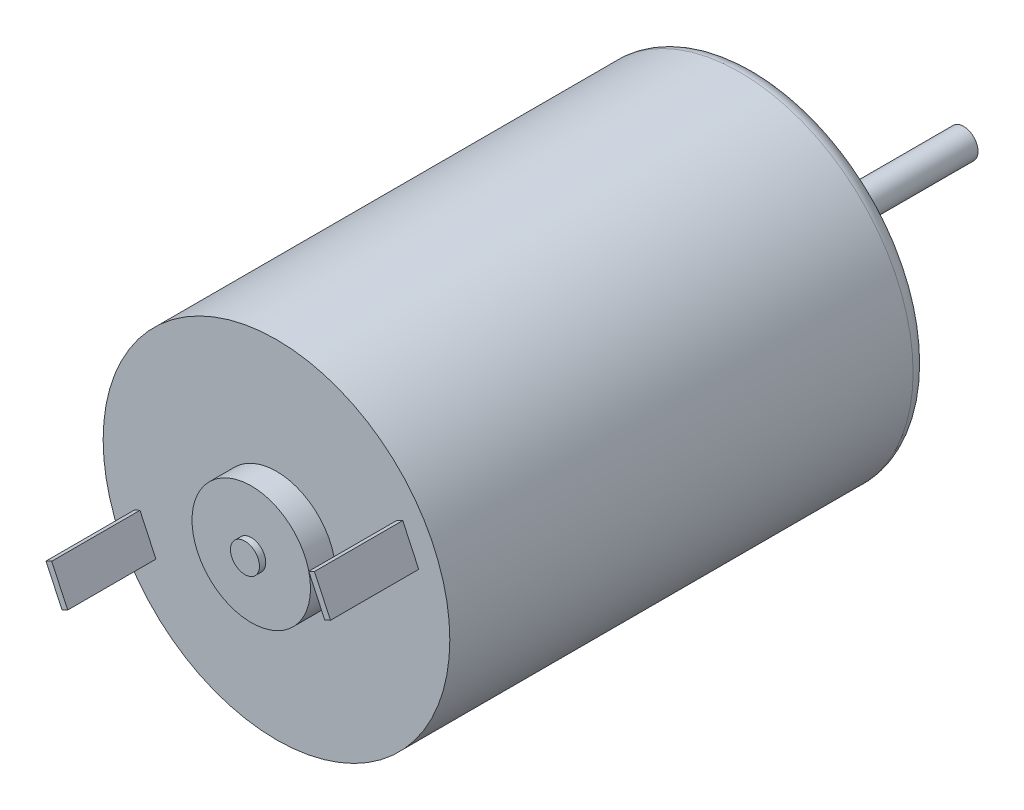
ISO-10303-21;
HEADER;
FILE_DESCRIPTION(('STEP AP214'),'2;1');
FILE_NAME('part.step','',(''),(''),'','','');
FILE_SCHEMA(('AUTOMOTIVE_DESIGN { 1 0 10303 214 1 1 1 1 }'));
ENDSEC;
DATA;
#1=APPLICATION_CONTEXT('core data for automotive mechanical design processes');
#2=APPLICATION_PROTOCOL_DEFINITION('international standard','automotive_design',2000,#1);
#3=PRODUCT_CONTEXT('',#1,'mechanical');
#4=PRODUCT('Part','Part','',(#3));
#5=PRODUCT_RELATED_PRODUCT_CATEGORY('part','',(#4));
#6=PRODUCT_DEFINITION_FORMATION('','',#4);
#7=PRODUCT_DEFINITION_CONTEXT('part definition',#1,'design');
#8=PRODUCT_DEFINITION('design','',#6,#7);
#9=PRODUCT_DEFINITION_SHAPE('','',#8);
#10=(LENGTH_UNIT() NAMED_UNIT(*) SI_UNIT(.MILLI.,.METRE.));
#11=(NAMED_UNIT(*) PLANE_ANGLE_UNIT() SI_UNIT($,.RADIAN.));
#12=(NAMED_UNIT(*) SI_UNIT($,.STERADIAN.) SOLID_ANGLE_UNIT());
#13=UNCERTAINTY_MEASURE_WITH_UNIT(LENGTH_MEASURE(1.E-05),#10,'distance_accuracy_value','');
#14=(GEOMETRIC_REPRESENTATION_CONTEXT(3) GLOBAL_UNCERTAINTY_ASSIGNED_CONTEXT((#13)) GLOBAL_UNIT_ASSIGNED_CONTEXT((#10,
#11,#12)) REPRESENTATION_CONTEXT('',''));
#15=CARTESIAN_POINT('',(0.,0.,0.));
#16=DIRECTION('',(0.,0.,1.));
#17=DIRECTION('',(1.,0.,0.));
#18=AXIS2_PLACEMENT_3D('',#15,#16,#17);
#19=CARTESIAN_POINT('',(-10.0151891050696,-6.32522625600825,45.));
#20=DIRECTION('',(0.906307787036647,0.422618261740705,0.));
#21=DIRECTION('',(-0.422618261740705,0.906307787036647,0.));
#22=AXIS2_PLACEMENT_3D('',#19,#20,#21);
#23=PLANE('',#22);
#24=DIRECTION('',(0.422618261740705,-0.906307787036647,0.));
#25=VECTOR('',#24,1.);
#26=CARTESIAN_POINT('',(-10.0151891050696,-6.32522625600825,38.));
#27=LINE('',#26,#25);
#28=CARTESIAN_POINT('',(-11.2830438902917,-3.6063028948983,38.));
#29=VERTEX_POINT('',#28);
#30=CARTESIAN_POINT('',(-10.0151891050696,-6.32522625600825,38.));
#31=VERTEX_POINT('',#30);
#32=EDGE_CURVE('E108',#29,#31,#27,.T.);
#33=ORIENTED_EDGE('',*,*,#32,.T.);
#34=DIRECTION('',(0.,0.,-1.));
#35=VECTOR('',#34,1.);
#36=CARTESIAN_POINT('',(-10.0151891050696,-6.32522625600825,45.));
#37=LINE('',#36,#35);
#38=CARTESIAN_POINT('',(-10.0151891050696,-6.32522625600825,45.));
#39=VERTEX_POINT('',#38);
#40=EDGE_CURVE('E12',#39,#31,#37,.T.);
#41=ORIENTED_EDGE('',*,*,#40,.F.);
#42=DIRECTION('',(0.422618261740705,-0.906307787036647,0.));
#43=VECTOR('',#42,1.);
#44=CARTESIAN_POINT('',(-10.0151891050696,-6.32522625600825,45.));
#45=LINE('',#44,#43);
#46=CARTESIAN_POINT('',(-11.2830438902917,-3.6063028948983,45.));
#47=VERTEX_POINT('',#46);
#48=EDGE_CURVE('E96',#47,#39,#45,.T.);
#49=ORIENTED_EDGE('',*,*,#48,.F.);
#50=DIRECTION('',(0.,0.,-1.));
#51=VECTOR('',#50,1.);
#52=CARTESIAN_POINT('',(-11.2830438902917,-3.6063028948983,45.));
#53=LINE('',#52,#51);
#54=EDGE_CURVE('E104',#47,#29,#53,.T.);
#55=ORIENTED_EDGE('',*,*,#54,.T.);
#56=EDGE_LOOP('',(#33,#41,#49,#55));
#57=FACE_BOUND('',#56,.T.);
#58=ADVANCED_FACE('F45',(#57),#23,.F.);
#59=CARTESIAN_POINT('',(-10.0151891050696,-6.32522625600825,45.));
#60=DIRECTION('',(-0.4226182617407,0.90630778703665,0.));
#61=DIRECTION('',(-0.90630778703665,-0.4226182617407,0.));
#62=AXIS2_PLACEMENT_3D('',#59,#60,#61);
#63=PLANE('',#62);
#64=DIRECTION('',(0.90630778703665,0.4226182617407,0.));
#65=VECTOR('',#64,1.);
#66=CARTESIAN_POINT('',(-10.0151891050696,-6.32522625600825,38.));
#67=LINE('',#66,#65);
#68=CARTESIAN_POINT('',(-9.56203521155124,-6.1139171251379,38.));
#69=VERTEX_POINT('',#68);
#70=EDGE_CURVE('E100',#31,#69,#67,.T.);
#71=ORIENTED_EDGE('',*,*,#70,.T.);
#72=DIRECTION('',(0.,0.,-1.));
#73=VECTOR('',#72,1.);
#74=CARTESIAN_POINT('',(-9.56203521155124,-6.1139171251379,45.));
#75=LINE('',#74,#73);
#76=CARTESIAN_POINT('',(-9.56203521155124,-6.1139171251379,45.));
#77=VERTEX_POINT('',#76);
#78=EDGE_CURVE('E53',#77,#69,#75,.T.);
#79=ORIENTED_EDGE('',*,*,#78,.F.);
#80=DIRECTION('',(0.90630778703665,0.4226182617407,0.));
#81=VECTOR('',#80,1.);
#82=CARTESIAN_POINT('',(-10.0151891050696,-6.32522625600825,45.));
#83=LINE('',#82,#81);
#84=EDGE_CURVE('E91',#39,#77,#83,.T.);
#85=ORIENTED_EDGE('',*,*,#84,.F.);
#86=ORIENTED_EDGE('',*,*,#40,.T.);
#87=EDGE_LOOP('',(#71,#79,#85,#86));
#88=FACE_BOUND('',#87,.T.);
#89=ADVANCED_FACE('F99',(#88),#63,.F.);
#90=CARTESIAN_POINT('',(-9.56203521155124,-6.1139171251379,45.));
#91=DIRECTION('',(-0.906307787036648,-0.422618261740704,0.));
#92=DIRECTION('',(0.422618261740704,-0.906307787036648,0.));
#93=AXIS2_PLACEMENT_3D('',#90,#91,#92);
#94=PLANE('',#93);
#95=DIRECTION('',(-0.422618261740704,0.906307787036648,0.));
#96=VECTOR('',#95,1.);
#97=CARTESIAN_POINT('',(-9.56203521155124,-6.1139171251379,38.));
#98=LINE('',#97,#96);
#99=CARTESIAN_POINT('',(-10.8298899967733,-3.39499376402795,38.));
#100=VERTEX_POINT('',#99);
#101=EDGE_CURVE('E78',#69,#100,#98,.T.);
#102=ORIENTED_EDGE('',*,*,#101,.T.);
#103=DIRECTION('',(0.,0.,-1.));
#104=VECTOR('',#103,1.);
#105=CARTESIAN_POINT('',(-10.8298899967733,-3.39499376402795,45.));
#106=LINE('',#105,#104);
#107=CARTESIAN_POINT('',(-10.8298899967733,-3.39499376402795,45.));
#108=VERTEX_POINT('',#107);
#109=EDGE_CURVE('E101',#108,#100,#106,.T.);
#110=ORIENTED_EDGE('',*,*,#109,.F.);
#111=DIRECTION('',(-0.422618261740704,0.906307787036648,0.));
#112=VECTOR('',#111,1.);
#113=CARTESIAN_POINT('',(-9.56203521155124,-6.1139171251379,45.));
#114=LINE('',#113,#112);
#115=EDGE_CURVE('E94',#77,#108,#114,.T.);
#116=ORIENTED_EDGE('',*,*,#115,.F.);
#117=ORIENTED_EDGE('',*,*,#78,.T.);
#118=EDGE_LOOP('',(#102,#110,#116,#117));
#119=FACE_BOUND('',#118,.T.);
#120=ADVANCED_FACE('F102',(#119),#94,.F.);
#121=CARTESIAN_POINT('',(-11.2830438902917,-3.6063028948983,45.));
#122=DIRECTION('',(0.4226182617407,-0.90630778703665,0.));
#123=DIRECTION('',(0.90630778703665,0.4226182617407,0.));
#124=AXIS2_PLACEMENT_3D('',#121,#122,#123);
#125=PLANE('',#124);
#126=DIRECTION('',(-0.90630778703665,-0.4226182617407,0.));
#127=VECTOR('',#126,1.);
#128=CARTESIAN_POINT('',(-11.2830438902917,-3.6063028948983,38.));
#129=LINE('',#128,#127);
#130=EDGE_CURVE('E84',#100,#29,#129,.T.);
#131=ORIENTED_EDGE('',*,*,#130,.T.);
#132=ORIENTED_EDGE('',*,*,#54,.F.);
#133=DIRECTION('',(-0.90630778703665,-0.4226182617407,0.));
#134=VECTOR('',#133,1.);
#135=CARTESIAN_POINT('',(-11.2830438902917,-3.6063028948983,45.));
#136=LINE('',#135,#134);
#137=EDGE_CURVE('E61',#108,#47,#136,.T.);
#138=ORIENTED_EDGE('',*,*,#137,.F.);
#139=ORIENTED_EDGE('',*,*,#109,.T.);
#140=EDGE_LOOP('',(#131,#132,#138,#139));
#141=FACE_BOUND('',#140,.T.);
#142=ADVANCED_FACE('F115',(#141),#125,.F.);
#143=CARTESIAN_POINT('',(0.,0.,45.));
#144=DIRECTION('',(0.,0.,-1.));
#145=DIRECTION('',(-1.,0.,0.));
#146=AXIS2_PLACEMENT_3D('',#143,#144,#145);
#147=PLANE('',#146);
#148=ORIENTED_EDGE('',*,*,#48,.T.);
#149=ORIENTED_EDGE('',*,*,#84,.T.);
#150=ORIENTED_EDGE('',*,*,#115,.T.);
#151=ORIENTED_EDGE('',*,*,#137,.T.);
#152=EDGE_LOOP('',(#148,#149,#150,#151));
#153=FACE_BOUND('',#152,.T.);
#154=ADVANCED_FACE('F92',(#153),#147,.F.);
#155=CARTESIAN_POINT('',(0.,0.,38.));
#156=DIRECTION('',(0.,0.,-1.));
#157=DIRECTION('',(-1.,0.,0.));
#158=AXIS2_PLACEMENT_3D('',#155,#156,#157);
#159=PLANE('',#158);
#160=ORIENTED_EDGE('',*,*,#32,.F.);
#161=ORIENTED_EDGE('',*,*,#130,.F.);
#162=ORIENTED_EDGE('',*,*,#101,.F.);
#163=ORIENTED_EDGE('',*,*,#70,.F.);
#164=EDGE_LOOP('',(#160,#161,#162,#163));
#165=FACE_BOUND('',#164,.T.);
#166=ADVANCED_FACE('F118',(#165),#159,.T.);
#167=CLOSED_SHELL('',(#58,#89,#120,#142,#154,#166));
#168=MANIFOLD_SOLID_BREP('B2',#167);
#169=CARTESIAN_POINT('',(11.2830438902917,3.60630289489831,45.));
#170=DIRECTION('',(-0.906307787036648,-0.422618261740704,0.));
#171=DIRECTION('',(0.422618261740704,-0.906307787036648,0.));
#172=AXIS2_PLACEMENT_3D('',#169,#170,#171);
#173=PLANE('',#172);
#174=DIRECTION('',(-0.422618261740704,0.906307787036648,0.));
#175=VECTOR('',#174,1.);
#176=CARTESIAN_POINT('',(11.2830438902917,3.60630289489831,38.));
#177=LINE('',#176,#175);
#178=CARTESIAN_POINT('',(11.2830438902917,3.60630289489831,38.));
#179=VERTEX_POINT('',#178);
#180=CARTESIAN_POINT('',(10.0151891050696,6.32522625600825,38.));
#181=VERTEX_POINT('',#180);
#182=EDGE_CURVE('E260',#179,#181,#177,.T.);
#183=ORIENTED_EDGE('',*,*,#182,.T.);
#184=DIRECTION('',(0.,0.,-1.));
#185=VECTOR('',#184,1.);
#186=CARTESIAN_POINT('',(10.0151891050696,6.32522625600825,45.));
#187=LINE('',#186,#185);
#188=CARTESIAN_POINT('',(10.0151891050696,6.32522625600825,45.));
#189=VERTEX_POINT('',#188);
#190=EDGE_CURVE('E43',#189,#181,#187,.T.);
#191=ORIENTED_EDGE('',*,*,#190,.F.);
#192=DIRECTION('',(-0.422618261740704,0.906307787036648,0.));
#193=VECTOR('',#192,1.);
#194=CARTESIAN_POINT('',(11.2830438902917,3.60630289489831,45.));
#195=LINE('',#194,#193);
#196=CARTESIAN_POINT('',(11.2830438902917,3.60630289489831,45.));
#197=VERTEX_POINT('',#196);
#198=EDGE_CURVE('E248',#197,#189,#195,.T.);
#199=ORIENTED_EDGE('',*,*,#198,.F.);
#200=DIRECTION('',(0.,0.,-1.));
#201=VECTOR('',#200,1.);
#202=CARTESIAN_POINT('',(11.2830438902917,3.60630289489831,45.));
#203=LINE('',#202,#201);
#204=EDGE_CURVE('E256',#197,#179,#203,.T.);
#205=ORIENTED_EDGE('',*,*,#204,.T.);
#206=EDGE_LOOP('',(#183,#191,#199,#205));
#207=FACE_BOUND('',#206,.T.);
#208=ADVANCED_FACE('F197',(#207),#173,.F.);
#209=CARTESIAN_POINT('',(10.0151891050696,6.32522625600825,45.));
#210=DIRECTION('',(0.422618261740706,-0.906307787036647,0.));
#211=DIRECTION('',(0.906307787036647,0.422618261740706,0.));
#212=AXIS2_PLACEMENT_3D('',#209,#210,#211);
#213=PLANE('',#212);
#214=DIRECTION('',(-0.906307787036647,-0.422618261740706,0.));
#215=VECTOR('',#214,1.);
#216=CARTESIAN_POINT('',(10.0151891050696,6.32522625600825,38.));
#217=LINE('',#216,#215);
#218=CARTESIAN_POINT('',(9.56203521155123,6.1139171251379,38.));
#219=VERTEX_POINT('',#218);
#220=EDGE_CURVE('E252',#181,#219,#217,.T.);
#221=ORIENTED_EDGE('',*,*,#220,.T.);
#222=DIRECTION('',(0.,0.,-1.));
#223=VECTOR('',#222,1.);
#224=CARTESIAN_POINT('',(9.56203521155123,6.1139171251379,45.));
#225=LINE('',#224,#223);
#226=CARTESIAN_POINT('',(9.56203521155123,6.1139171251379,45.));
#227=VERTEX_POINT('',#226);
#228=EDGE_CURVE('E205',#227,#219,#225,.T.);
#229=ORIENTED_EDGE('',*,*,#228,.F.);
#230=DIRECTION('',(-0.906307787036647,-0.422618261740706,0.));
#231=VECTOR('',#230,1.);
#232=CARTESIAN_POINT('',(10.0151891050696,6.32522625600825,45.));
#233=LINE('',#232,#231);
#234=EDGE_CURVE('E243',#189,#227,#233,.T.);
#235=ORIENTED_EDGE('',*,*,#234,.F.);
#236=ORIENTED_EDGE('',*,*,#190,.T.);
#237=EDGE_LOOP('',(#221,#229,#235,#236));
#238=FACE_BOUND('',#237,.T.);
#239=ADVANCED_FACE('F251',(#238),#213,.F.);
#240=CARTESIAN_POINT('',(10.8298899967733,3.39499376402795,45.));
#241=DIRECTION('',(0.906307787036647,0.422618261740705,0.));
#242=DIRECTION('',(-0.422618261740705,0.906307787036647,0.));
#243=AXIS2_PLACEMENT_3D('',#240,#241,#242);
#244=PLANE('',#243);
#245=DIRECTION('',(0.422618261740705,-0.906307787036647,0.));
#246=VECTOR('',#245,1.);
#247=CARTESIAN_POINT('',(10.8298899967733,3.39499376402795,38.));
#248=LINE('',#247,#246);
#249=CARTESIAN_POINT('',(10.8298899967733,3.39499376402795,38.));
#250=VERTEX_POINT('',#249);
#251=EDGE_CURVE('E230',#219,#250,#248,.T.);
#252=ORIENTED_EDGE('',*,*,#251,.T.);
#253=DIRECTION('',(0.,0.,-1.));
#254=VECTOR('',#253,1.);
#255=CARTESIAN_POINT('',(10.8298899967733,3.39499376402795,45.));
#256=LINE('',#255,#254);
#257=CARTESIAN_POINT('',(10.8298899967733,3.39499376402795,45.));
#258=VERTEX_POINT('',#257);
#259=EDGE_CURVE('E253',#258,#250,#256,.T.);
#260=ORIENTED_EDGE('',*,*,#259,.F.);
#261=DIRECTION('',(0.422618261740705,-0.906307787036647,0.));
#262=VECTOR('',#261,1.);
#263=CARTESIAN_POINT('',(10.8298899967733,3.39499376402795,45.));
#264=LINE('',#263,#262);
#265=EDGE_CURVE('E246',#227,#258,#264,.T.);
#266=ORIENTED_EDGE('',*,*,#265,.F.);
#267=ORIENTED_EDGE('',*,*,#228,.T.);
#268=EDGE_LOOP('',(#252,#260,#266,#267));
#269=FACE_BOUND('',#268,.T.);
#270=ADVANCED_FACE('F254',(#269),#244,.F.);
#271=CARTESIAN_POINT('',(11.2830438902917,3.60630289489831,45.));
#272=DIRECTION('',(-0.422618261740708,0.906307787036646,0.));
#273=DIRECTION('',(-0.906307787036646,-0.422618261740708,0.));
#274=AXIS2_PLACEMENT_3D('',#271,#272,#273);
#275=PLANE('',#274);
#276=DIRECTION('',(0.906307787036646,0.422618261740707,0.));
#277=VECTOR('',#276,1.);
#278=CARTESIAN_POINT('',(11.2830438902917,3.60630289489831,38.));
#279=LINE('',#278,#277);
#280=EDGE_CURVE('E236',#250,#179,#279,.T.);
#281=ORIENTED_EDGE('',*,*,#280,.T.);
#282=ORIENTED_EDGE('',*,*,#204,.F.);
#283=DIRECTION('',(0.906307787036646,0.422618261740707,0.));
#284=VECTOR('',#283,1.);
#285=CARTESIAN_POINT('',(11.2830438902917,3.60630289489831,45.));
#286=LINE('',#285,#284);
#287=EDGE_CURVE('E213',#258,#197,#286,.T.);
#288=ORIENTED_EDGE('',*,*,#287,.F.);
#289=ORIENTED_EDGE('',*,*,#259,.T.);
#290=EDGE_LOOP('',(#281,#282,#288,#289));
#291=FACE_BOUND('',#290,.T.);
#292=ADVANCED_FACE('F267',(#291),#275,.F.);
#293=CARTESIAN_POINT('',(0.,0.,45.));
#294=DIRECTION('',(0.,0.,1.));
#295=DIRECTION('',(1.,0.,0.));
#296=AXIS2_PLACEMENT_3D('',#293,#294,#295);
#297=PLANE('',#296);
#298=ORIENTED_EDGE('',*,*,#198,.T.);
#299=ORIENTED_EDGE('',*,*,#234,.T.);
#300=ORIENTED_EDGE('',*,*,#265,.T.);
#301=ORIENTED_EDGE('',*,*,#287,.T.);
#302=EDGE_LOOP('',(#298,#299,#300,#301));
#303=FACE_BOUND('',#302,.T.);
#304=ADVANCED_FACE('F244',(#303),#297,.T.);
#305=CARTESIAN_POINT('',(0.,0.,38.));
#306=DIRECTION('',(0.,0.,1.));
#307=DIRECTION('',(1.,0.,0.));
#308=AXIS2_PLACEMENT_3D('',#305,#306,#307);
#309=PLANE('',#308);
#310=ORIENTED_EDGE('',*,*,#182,.F.);
#311=ORIENTED_EDGE('',*,*,#280,.F.);
#312=ORIENTED_EDGE('',*,*,#251,.F.);
#313=ORIENTED_EDGE('',*,*,#220,.F.);
#314=EDGE_LOOP('',(#310,#311,#312,#313));
#315=FACE_BOUND('',#314,.T.);
#316=ADVANCED_FACE('F270',(#315),#309,.F.);
#317=CLOSED_SHELL('',(#208,#239,#270,#292,#304,#316));
#318=MANIFOLD_SOLID_BREP('B6',#317);
#319=CARTESIAN_POINT('',(0.,0.,40.5));
#320=DIRECTION('',(0.,0.,1.));
#321=DIRECTION('',(1.,0.,0.));
#322=AXIS2_PLACEMENT_3D('',#319,#320,#321);
#323=PLANE('',#322);
#324=CARTESIAN_POINT('',(0.,0.,40.5));
#325=DIRECTION('',(0.,0.,1.));
#326=DIRECTION('',(1.,0.,0.));
#327=AXIS2_PLACEMENT_3D('',#324,#325,#326);
#328=CIRCLE('',#327,1.15);
#329=CARTESIAN_POINT('',(1.15,0.,40.5));
#330=VERTEX_POINT('',#329);
#331=EDGE_CURVE('E196',#330,#330,#328,.F.);
#332=ORIENTED_EDGE('',*,*,#331,.F.);
#333=EDGE_LOOP('',(#332));
#334=FACE_BOUND('',#333,.T.);
#335=ADVANCED_FACE('F328',(#334),#323,.T.);
#336=CARTESIAN_POINT('',(0.,0.,44.2526911934581));
#337=DIRECTION('',(0.,0.,-1.));
#338=DIRECTION('',(-1.,0.,0.));
#339=AXIS2_PLACEMENT_3D('',#336,#337,#338);
#340=CYLINDRICAL_SURFACE('',#339,1.15);
#341=ORIENTED_EDGE('',*,*,#331,.T.);
#342=EDGE_LOOP('',(#341));
#343=FACE_BOUND('',#342,.T.);
#344=CARTESIAN_POINT('',(0.,0.,-16.5));
#345=DIRECTION('',(0.,0.,-1.));
#346=DIRECTION('',(-1.,0.,0.));
#347=AXIS2_PLACEMENT_3D('',#344,#345,#346);
#348=CIRCLE('',#347,1.15);
#349=CARTESIAN_POINT('',(-1.15,0.,-16.5));
#350=VERTEX_POINT('',#349);
#351=EDGE_CURVE('E334',#350,#350,#348,.T.);
#352=ORIENTED_EDGE('',*,*,#351,.F.);
#353=EDGE_LOOP('',(#352));
#354=FACE_BOUND('',#353,.T.);
#355=ADVANCED_FACE('F342',(#343,#354),#340,.T.);
#356=CARTESIAN_POINT('',(0.,0.,-16.5));
#357=DIRECTION('',(0.,0.,-1.));
#358=DIRECTION('',(-1.,0.,0.));
#359=AXIS2_PLACEMENT_3D('',#356,#357,#358);
#360=PLANE('',#359);
#361=ORIENTED_EDGE('',*,*,#351,.T.);
#362=EDGE_LOOP('',(#361));
#363=FACE_BOUND('',#362,.T.);
#364=ADVANCED_FACE('F340',(#363),#360,.T.);
#365=CLOSED_SHELL('',(#335,#355,#364));
#366=MANIFOLD_SOLID_BREP('B37',#365);
#367=CARTESIAN_POINT('',(0.,0.,38.));
#368=DIRECTION('',(0.,0.,-1.));
#369=DIRECTION('',(-1.,0.,0.));
#370=AXIS2_PLACEMENT_3D('',#367,#368,#369);
#371=CYLINDRICAL_SURFACE('',#370,13.75);
#372=CARTESIAN_POINT('',(0.,0.,1.25));
#373=DIRECTION('',(0.,0.,1.));
#374=DIRECTION('',(1.,0.,0.));
#375=AXIS2_PLACEMENT_3D('',#372,#373,#374);
#376=CIRCLE('',#375,13.75);
#377=CARTESIAN_POINT('',(13.75,0.,1.25));
#378=VERTEX_POINT('',#377);
#379=EDGE_CURVE('E376',#378,#378,#376,.T.);
#380=ORIENTED_EDGE('',*,*,#379,.T.);
#381=EDGE_LOOP('',(#380));
#382=FACE_BOUND('',#381,.T.);
#383=CARTESIAN_POINT('',(0.,0.,38.));
#384=DIRECTION('',(0.,0.,1.));
#385=DIRECTION('',(1.,0.,0.));
#386=AXIS2_PLACEMENT_3D('',#383,#384,#385);
#387=CIRCLE('',#386,13.75);
#388=CARTESIAN_POINT('',(13.75,0.,38.));
#389=VERTEX_POINT('',#388);
#390=EDGE_CURVE('E387',#389,#389,#387,.T.);
#391=ORIENTED_EDGE('',*,*,#390,.F.);
#392=EDGE_LOOP('',(#391));
#393=FACE_BOUND('',#392,.T.);
#394=ADVANCED_FACE('F369',(#382,#393),#371,.T.);
#395=CARTESIAN_POINT('',(0.,0.,38.));
#396=DIRECTION('',(0.,0.,1.));
#397=DIRECTION('',(1.,0.,0.));
#398=AXIS2_PLACEMENT_3D('',#395,#396,#397);
#399=PLANE('',#398);
#400=CARTESIAN_POINT('',(0.,0.,38.));
#401=DIRECTION('',(0.,0.,1.));
#402=DIRECTION('',(1.,0.,0.));
#403=AXIS2_PLACEMENT_3D('',#400,#401,#402);
#404=CIRCLE('',#403,4.7);
#405=CARTESIAN_POINT('',(4.7,0.,38.));
#406=VERTEX_POINT('',#405);
#407=EDGE_CURVE('E380',#406,#406,#404,.T.);
#408=ORIENTED_EDGE('',*,*,#407,.F.);
#409=EDGE_LOOP('',(#408));
#410=FACE_BOUND('',#409,.T.);
#411=ORIENTED_EDGE('',*,*,#390,.T.);
#412=EDGE_LOOP('',(#411));
#413=FACE_BOUND('',#412,.T.);
#414=ADVANCED_FACE('F424',(#410,#413),#399,.T.);
#415=CARTESIAN_POINT('',(0.,0.,0.));
#416=DIRECTION('',(0.,0.,1.));
#417=DIRECTION('',(1.,0.,0.));
#418=AXIS2_PLACEMENT_3D('',#415,#416,#417);
#419=PLANE('',#418);
#420=CARTESIAN_POINT('',(0.,0.,0.));
#421=DIRECTION('',(0.,0.,1.));
#422=DIRECTION('',(1.,0.,0.));
#423=AXIS2_PLACEMENT_3D('',#420,#421,#422);
#424=CIRCLE('',#423,12.5);
#425=CARTESIAN_POINT('',(12.5,0.,0.));
#426=VERTEX_POINT('',#425);
#427=EDGE_CURVE('E327',#426,#426,#424,.F.);
#428=ORIENTED_EDGE('',*,*,#427,.T.);
#429=EDGE_LOOP('',(#428));
#430=FACE_BOUND('',#429,.T.);
#431=CARTESIAN_POINT('',(-7.25046229629321,3.38094609392557,0.));
#432=DIRECTION('',(0.,0.,-1.));
#433=DIRECTION('',(-1.,0.,0.));
#434=AXIS2_PLACEMENT_3D('',#431,#432,#433);
#435=CIRCLE('',#434,1.);
#436=CARTESIAN_POINT('',(-8.25046229629321,3.38094609392557,0.));
#437=VERTEX_POINT('',#436);
#438=EDGE_CURVE('E405',#437,#437,#435,.T.);
#439=ORIENTED_EDGE('',*,*,#438,.F.);
#440=EDGE_LOOP('',(#439));
#441=FACE_BOUND('',#440,.T.);
#442=CARTESIAN_POINT('',(7.25046229629321,-3.38094609392558,0.));
#443=DIRECTION('',(0.,0.,-1.));
#444=DIRECTION('',(-1.,0.,0.));
#445=AXIS2_PLACEMENT_3D('',#442,#443,#444);
#446=CIRCLE('',#445,1.);
#447=CARTESIAN_POINT('',(6.25046229629321,-3.38094609392558,0.));
#448=VERTEX_POINT('',#447);
#449=EDGE_CURVE('E399',#448,#448,#446,.T.);
#450=ORIENTED_EDGE('',*,*,#449,.F.);
#451=EDGE_LOOP('',(#450));
#452=FACE_BOUND('',#451,.T.);
#453=CARTESIAN_POINT('',(0.,0.,0.));
#454=DIRECTION('',(0.,0.,-1.));
#455=DIRECTION('',(-1.,0.,0.));
#456=AXIS2_PLACEMENT_3D('',#453,#454,#455);
#457=CIRCLE('',#456,5.);
#458=CARTESIAN_POINT('',(-5.,0.,0.));
#459=VERTEX_POINT('',#458);
#460=EDGE_CURVE('E384',#459,#459,#457,.T.);
#461=ORIENTED_EDGE('',*,*,#460,.F.);
#462=EDGE_LOOP('',(#461));
#463=FACE_BOUND('',#462,.T.);
#464=ADVANCED_FACE('F420',(#430,#441,#452,#463),#419,.F.);
#465=CARTESIAN_POINT('',(0.,0.,-3.5));
#466=DIRECTION('',(0.,0.,1.));
#467=DIRECTION('',(1.,0.,0.));
#468=AXIS2_PLACEMENT_3D('',#465,#466,#467);
#469=CYLINDRICAL_SURFACE('',#468,5.);
#470=CARTESIAN_POINT('',(0.,0.,-3.5));
#471=DIRECTION('',(0.,0.,-1.));
#472=DIRECTION('',(-1.,0.,0.));
#473=AXIS2_PLACEMENT_3D('',#470,#471,#472);
#474=CIRCLE('',#473,5.);
#475=CARTESIAN_POINT('',(-5.,0.,-3.5));
#476=VERTEX_POINT('',#475);
#477=EDGE_CURVE('E390',#476,#476,#474,.T.);
#478=ORIENTED_EDGE('',*,*,#477,.F.);
#479=EDGE_LOOP('',(#478));
#480=FACE_BOUND('',#479,.T.);
#481=ORIENTED_EDGE('',*,*,#460,.T.);
#482=EDGE_LOOP('',(#481));
#483=FACE_BOUND('',#482,.T.);
#484=ADVANCED_FACE('F423',(#480,#483),#469,.T.);
#485=CARTESIAN_POINT('',(0.,0.,-3.5));
#486=DIRECTION('',(0.,0.,-1.));
#487=DIRECTION('',(-1.,0.,0.));
#488=AXIS2_PLACEMENT_3D('',#485,#486,#487);
#489=PLANE('',#488);
#490=ORIENTED_EDGE('',*,*,#477,.T.);
#491=EDGE_LOOP('',(#490));
#492=FACE_BOUND('',#491,.T.);
#493=ADVANCED_FACE('F431',(#492),#489,.T.);
#494=CARTESIAN_POINT('',(0.,0.,40.));
#495=DIRECTION('',(0.,0.,-1.));
#496=DIRECTION('',(-1.,0.,0.));
#497=AXIS2_PLACEMENT_3D('',#494,#495,#496);
#498=CYLINDRICAL_SURFACE('',#497,4.7);
#499=CARTESIAN_POINT('',(0.,0.,40.));
#500=DIRECTION('',(0.,0.,1.));
#501=DIRECTION('',(1.,0.,0.));
#502=AXIS2_PLACEMENT_3D('',#499,#500,#501);
#503=CIRCLE('',#502,4.7);
#504=CARTESIAN_POINT('',(4.7,0.,40.));
#505=VERTEX_POINT('',#504);
#506=EDGE_CURVE('E394',#505,#505,#503,.T.);
#507=ORIENTED_EDGE('',*,*,#506,.F.);
#508=EDGE_LOOP('',(#507));
#509=FACE_BOUND('',#508,.T.);
#510=ORIENTED_EDGE('',*,*,#407,.T.);
#511=EDGE_LOOP('',(#510));
#512=FACE_BOUND('',#511,.T.);
#513=ADVANCED_FACE('F437',(#509,#512),#498,.T.);
#514=CARTESIAN_POINT('',(0.,0.,40.));
#515=DIRECTION('',(0.,0.,1.));
#516=DIRECTION('',(1.,0.,0.));
#517=AXIS2_PLACEMENT_3D('',#514,#515,#516);
#518=PLANE('',#517);
#519=ORIENTED_EDGE('',*,*,#506,.T.);
#520=EDGE_LOOP('',(#519));
#521=FACE_BOUND('',#520,.T.);
#522=ADVANCED_FACE('F455',(#521),#518,.T.);
#523=CARTESIAN_POINT('',(7.25046229629321,-3.38094609392558,2.));
#524=DIRECTION('',(0.,0.,-1.));
#525=DIRECTION('',(-1.,0.,0.));
#526=AXIS2_PLACEMENT_3D('',#523,#524,#525);
#527=CYLINDRICAL_SURFACE('',#526,1.);
#528=CARTESIAN_POINT('',(7.25046229629321,-3.38094609392558,2.));
#529=DIRECTION('',(0.,0.,-1.));
#530=DIRECTION('',(-1.,0.,0.));
#531=AXIS2_PLACEMENT_3D('',#528,#529,#530);
#532=CIRCLE('',#531,1.);
#533=CARTESIAN_POINT('',(6.25046229629321,-3.38094609392558,2.));
#534=VERTEX_POINT('',#533);
#535=EDGE_CURVE('E402',#534,#534,#532,.T.);
#536=ORIENTED_EDGE('',*,*,#535,.F.);
#537=EDGE_LOOP('',(#536));
#538=FACE_BOUND('',#537,.T.);
#539=ORIENTED_EDGE('',*,*,#449,.T.);
#540=EDGE_LOOP('',(#539));
#541=FACE_BOUND('',#540,.T.);
#542=ADVANCED_FACE('F461',(#538,#541),#527,.F.);
#543=CARTESIAN_POINT('',(7.25046229629321,-3.38094609392558,2.));
#544=DIRECTION('',(0.,0.,-1.));
#545=DIRECTION('',(-1.,0.,0.));
#546=AXIS2_PLACEMENT_3D('',#543,#544,#545);
#547=PLANE('',#546);
#548=ORIENTED_EDGE('',*,*,#535,.T.);
#549=EDGE_LOOP('',(#548));
#550=FACE_BOUND('',#549,.T.);
#551=ADVANCED_FACE('F416',(#550),#547,.T.);
#552=CARTESIAN_POINT('',(-7.25046229629321,3.38094609392557,2.));
#553=DIRECTION('',(0.,0.,-1.));
#554=DIRECTION('',(-1.,0.,0.));
#555=AXIS2_PLACEMENT_3D('',#552,#553,#554);
#556=CYLINDRICAL_SURFACE('',#555,1.);
#557=CARTESIAN_POINT('',(-7.25046229629321,3.38094609392557,2.));
#558=DIRECTION('',(0.,0.,-1.));
#559=DIRECTION('',(-1.,0.,0.));
#560=AXIS2_PLACEMENT_3D('',#557,#558,#559);
#561=CIRCLE('',#560,1.);
#562=CARTESIAN_POINT('',(-8.25046229629321,3.38094609392557,2.));
#563=VERTEX_POINT('',#562);
#564=EDGE_CURVE('E398',#563,#563,#561,.T.);
#565=ORIENTED_EDGE('',*,*,#564,.F.);
#566=EDGE_LOOP('',(#565));
#567=FACE_BOUND('',#566,.T.);
#568=ORIENTED_EDGE('',*,*,#438,.T.);
#569=EDGE_LOOP('',(#568));
#570=FACE_BOUND('',#569,.T.);
#571=ADVANCED_FACE('F413',(#567,#570),#556,.F.);
#572=CARTESIAN_POINT('',(-7.25046229629321,3.38094609392557,2.));
#573=DIRECTION('',(0.,0.,-1.));
#574=DIRECTION('',(-1.,0.,0.));
#575=AXIS2_PLACEMENT_3D('',#572,#573,#574);
#576=PLANE('',#575);
#577=ORIENTED_EDGE('',*,*,#564,.T.);
#578=EDGE_LOOP('',(#577));
#579=FACE_BOUND('',#578,.T.);
#580=ADVANCED_FACE('F411',(#579),#576,.T.);
#581=CARTESIAN_POINT('',(0.,0.,1.25));
#582=DIRECTION('',(0.,0.,1.));
#583=DIRECTION('',(1.,0.,0.));
#584=AXIS2_PLACEMENT_3D('',#581,#582,#583);
#585=TOROIDAL_SURFACE('',#584,12.5,1.25);
#586=ORIENTED_EDGE('',*,*,#427,.F.);
#587=EDGE_LOOP('',(#586));
#588=FACE_BOUND('',#587,.T.);
#589=ORIENTED_EDGE('',*,*,#379,.F.);
#590=EDGE_LOOP('',(#589));
#591=FACE_BOUND('',#590,.T.);
#592=ADVANCED_FACE('F371',(#588,#591),#585,.T.);
#593=CLOSED_SHELL('',(#394,#414,#464,#484,#493,#513,#522,#542,#551,#571,#580,#592));
#594=MANIFOLD_SOLID_BREP('B191',#593);
#595=ADVANCED_BREP_SHAPE_REPRESENTATION('',(#18,#168,#318,#366,#594),#14);
#596=SHAPE_DEFINITION_REPRESENTATION(#9,#595);
ENDSEC;
END-ISO-10303-21;
